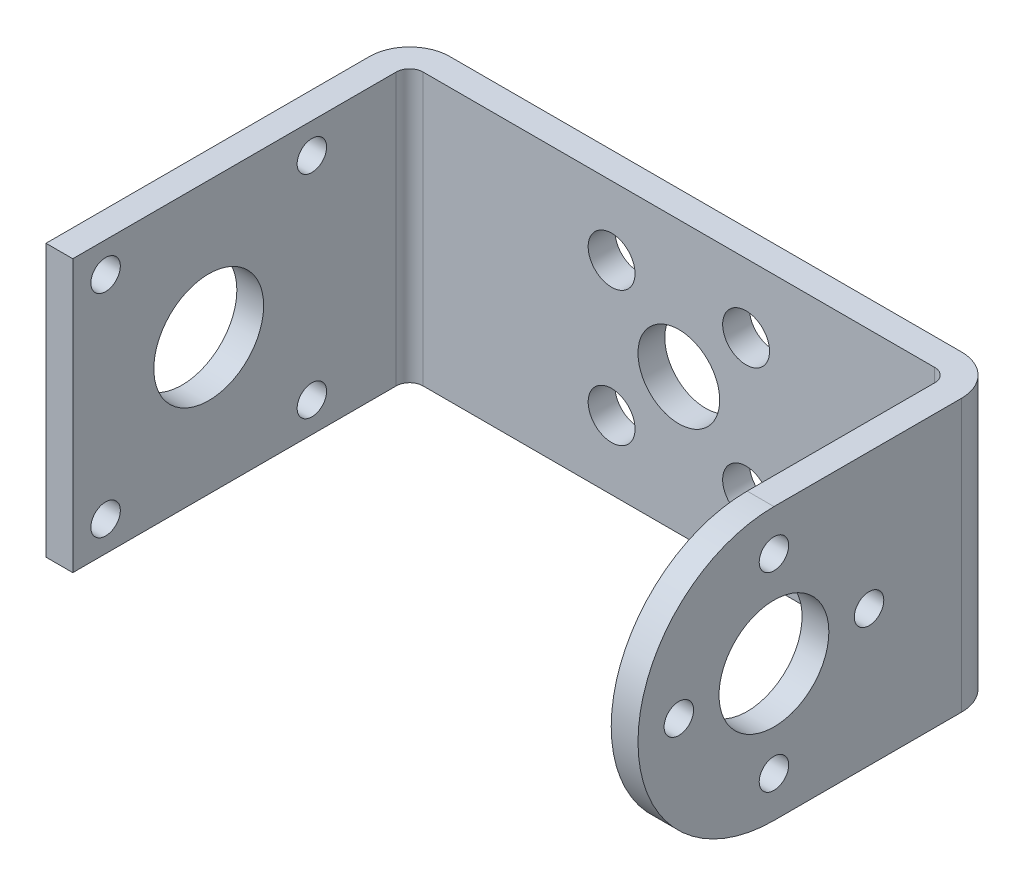
ISO-10303-21;
HEADER;
FILE_DESCRIPTION(('STEP AP214'),'2;1');
FILE_NAME('part.step','',(''),(''),'','','');
FILE_SCHEMA(('AUTOMOTIVE_DESIGN { 1 0 10303 214 1 1 1 1 }'));
ENDSEC;
DATA;
#1=APPLICATION_CONTEXT('core data for automotive mechanical design processes');
#2=APPLICATION_PROTOCOL_DEFINITION('international standard','automotive_design',2000,#1);
#3=PRODUCT_CONTEXT('',#1,'mechanical');
#4=PRODUCT('Part','Part','',(#3));
#5=PRODUCT_RELATED_PRODUCT_CATEGORY('part','',(#4));
#6=PRODUCT_DEFINITION_FORMATION('','',#4);
#7=PRODUCT_DEFINITION_CONTEXT('part definition',#1,'design');
#8=PRODUCT_DEFINITION('design','',#6,#7);
#9=PRODUCT_DEFINITION_SHAPE('','',#8);
#10=(LENGTH_UNIT() NAMED_UNIT(*) SI_UNIT(.MILLI.,.METRE.));
#11=(NAMED_UNIT(*) PLANE_ANGLE_UNIT() SI_UNIT($,.RADIAN.));
#12=(NAMED_UNIT(*) SI_UNIT($,.STERADIAN.) SOLID_ANGLE_UNIT());
#13=UNCERTAINTY_MEASURE_WITH_UNIT(LENGTH_MEASURE(1.E-05),#10,'distance_accuracy_value','');
#14=(GEOMETRIC_REPRESENTATION_CONTEXT(3) GLOBAL_UNCERTAINTY_ASSIGNED_CONTEXT((#13)) GLOBAL_UNIT_ASSIGNED_CONTEXT((#10,
#11,#12)) REPRESENTATION_CONTEXT('',''));
#15=CARTESIAN_POINT('',(0.,0.,0.));
#16=DIRECTION('',(0.,0.,1.));
#17=DIRECTION('',(1.,0.,0.));
#18=AXIS2_PLACEMENT_3D('',#15,#16,#17);
#19=CARTESIAN_POINT('',(0.,0.,-18.5528756476684));
#20=DIRECTION('',(0.,1.,0.));
#21=DIRECTION('',(1.,0.,0.));
#22=AXIS2_PLACEMENT_3D('',#19,#20,#21);
#23=PLANE('',#22);
#24=CARTESIAN_POINT('',(19.1,0.,-24.15));
#25=DIRECTION('',(0.,1.,0.));
#26=DIRECTION('',(0.707106781186547,0.,-0.707106781186548));
#27=AXIS2_PLACEMENT_3D('',#24,#25,#26);
#28=CIRCLE('',#27,3.);
#29=CARTESIAN_POINT('',(22.1,0.,-24.15));
#30=VERTEX_POINT('',#29);
#31=CARTESIAN_POINT('',(19.1,0.,-27.15));
#32=VERTEX_POINT('',#31);
#33=EDGE_CURVE('E371',#30,#32,#28,.T.);
#34=ORIENTED_EDGE('',*,*,#33,.F.);
#35=DIRECTION('',(0.,0.,-1.));
#36=VECTOR('',#35,1.);
#37=CARTESIAN_POINT('',(22.1,0.,0.));
#38=LINE('',#37,#36);
#39=CARTESIAN_POINT('',(22.1,0.,-10.15));
#40=VERTEX_POINT('',#39);
#41=EDGE_CURVE('E517',#40,#30,#38,.T.);
#42=ORIENTED_EDGE('',*,*,#41,.F.);
#43=DIRECTION('',(1.,0.,0.));
#44=VECTOR('',#43,1.);
#45=CARTESIAN_POINT('',(10.05,0.,-10.15));
#46=LINE('',#45,#44);
#47=CARTESIAN_POINT('',(20.1,0.,-10.15));
#48=VERTEX_POINT('',#47);
#49=EDGE_CURVE('E383',#48,#40,#46,.T.);
#50=ORIENTED_EDGE('',*,*,#49,.F.);
#51=DIRECTION('',(0.,0.,1.));
#52=VECTOR('',#51,1.);
#53=CARTESIAN_POINT('',(20.1,0.,-25.15));
#54=LINE('',#53,#52);
#55=CARTESIAN_POINT('',(20.1,0.,-24.15));
#56=VERTEX_POINT('',#55);
#57=EDGE_CURVE('E327',#56,#48,#54,.T.);
#58=ORIENTED_EDGE('',*,*,#57,.F.);
#59=CARTESIAN_POINT('',(19.1,0.,-24.15));
#60=DIRECTION('',(0.,-1.,0.));
#61=DIRECTION('',(0.707106781186546,0.,-0.707106781186549));
#62=AXIS2_PLACEMENT_3D('',#59,#60,#61);
#63=CIRCLE('',#62,1.);
#64=CARTESIAN_POINT('',(19.1,0.,-25.15));
#65=VERTEX_POINT('',#64);
#66=EDGE_CURVE('E332',#65,#56,#63,.T.);
#67=ORIENTED_EDGE('',*,*,#66,.F.);
#68=DIRECTION('',(1.,0.,0.));
#69=VECTOR('',#68,1.);
#70=CARTESIAN_POINT('',(-20.1,0.,-25.15));
#71=LINE('',#70,#69);
#72=CARTESIAN_POINT('',(-19.1,0.,-25.15));
#73=VERTEX_POINT('',#72);
#74=EDGE_CURVE('E379',#73,#65,#71,.T.);
#75=ORIENTED_EDGE('',*,*,#74,.F.);
#76=CARTESIAN_POINT('',(-19.1,0.,-24.15));
#77=DIRECTION('',(0.,-1.,0.));
#78=DIRECTION('',(-0.707106781186546,0.,-0.707106781186549));
#79=AXIS2_PLACEMENT_3D('',#76,#77,#78);
#80=CIRCLE('',#79,1.);
#81=CARTESIAN_POINT('',(-20.1,0.,-24.15));
#82=VERTEX_POINT('',#81);
#83=EDGE_CURVE('E337',#82,#73,#80,.T.);
#84=ORIENTED_EDGE('',*,*,#83,.F.);
#85=DIRECTION('',(0.,0.,-1.));
#86=VECTOR('',#85,1.);
#87=CARTESIAN_POINT('',(-20.1,0.,0.));
#88=LINE('',#87,#86);
#89=CARTESIAN_POINT('',(-20.1,0.,0.));
#90=VERTEX_POINT('',#89);
#91=EDGE_CURVE('E27',#90,#82,#88,.T.);
#92=ORIENTED_EDGE('',*,*,#91,.F.);
#93=DIRECTION('',(1.,0.,0.));
#94=VECTOR('',#93,1.);
#95=CARTESIAN_POINT('',(-22.1,0.,0.));
#96=LINE('',#95,#94);
#97=CARTESIAN_POINT('',(-22.1,0.,0.));
#98=VERTEX_POINT('',#97);
#99=EDGE_CURVE('E11',#98,#90,#96,.T.);
#100=ORIENTED_EDGE('',*,*,#99,.F.);
#101=DIRECTION('',(0.,0.,1.));
#102=VECTOR('',#101,1.);
#103=CARTESIAN_POINT('',(-22.1,0.,-27.15));
#104=LINE('',#103,#102);
#105=CARTESIAN_POINT('',(-22.1,0.,-24.15));
#106=VERTEX_POINT('',#105);
#107=EDGE_CURVE('E348',#106,#98,#104,.T.);
#108=ORIENTED_EDGE('',*,*,#107,.F.);
#109=CARTESIAN_POINT('',(-19.1,0.,-24.15));
#110=DIRECTION('',(0.,1.,0.));
#111=DIRECTION('',(-0.707106781186548,0.,-0.707106781186548));
#112=AXIS2_PLACEMENT_3D('',#109,#110,#111);
#113=CIRCLE('',#112,3.);
#114=CARTESIAN_POINT('',(-19.1,0.,-27.15));
#115=VERTEX_POINT('',#114);
#116=EDGE_CURVE('E272',#115,#106,#113,.T.);
#117=ORIENTED_EDGE('',*,*,#116,.F.);
#118=DIRECTION('',(-1.,0.,0.));
#119=VECTOR('',#118,1.);
#120=CARTESIAN_POINT('',(22.1,0.,-27.15));
#121=LINE('',#120,#119);
#122=EDGE_CURVE('E367',#32,#115,#121,.T.);
#123=ORIENTED_EDGE('',*,*,#122,.F.);
#124=EDGE_LOOP('',(#34,#42,#50,#58,#67,#75,#84,#92,#100,#108,#117,#123));
#125=FACE_BOUND('',#124,.T.);
#126=ADVANCED_FACE('F16',(#125),#23,.F.);
#127=CARTESIAN_POINT('',(-22.1,0.,0.));
#128=DIRECTION('',(0.,0.,1.));
#129=DIRECTION('',(1.,0.,0.));
#130=AXIS2_PLACEMENT_3D('',#127,#128,#129);
#131=PLANE('',#130);
#132=ORIENTED_EDGE('',*,*,#99,.T.);
#133=DIRECTION('',(0.,1.,0.));
#134=VECTOR('',#133,1.);
#135=CARTESIAN_POINT('',(-20.1,0.,0.));
#136=LINE('',#135,#134);
#137=CARTESIAN_POINT('',(-20.1,20.3,0.));
#138=VERTEX_POINT('',#137);
#139=EDGE_CURVE('E347',#90,#138,#136,.T.);
#140=ORIENTED_EDGE('',*,*,#139,.T.);
#141=DIRECTION('',(1.,0.,0.));
#142=VECTOR('',#141,1.);
#143=CARTESIAN_POINT('',(-22.1,20.3,0.));
#144=LINE('',#143,#142);
#145=CARTESIAN_POINT('',(-22.1,20.3,0.));
#146=VERTEX_POINT('',#145);
#147=EDGE_CURVE('E410',#146,#138,#144,.T.);
#148=ORIENTED_EDGE('',*,*,#147,.F.);
#149=DIRECTION('',(0.,1.,0.));
#150=VECTOR('',#149,1.);
#151=CARTESIAN_POINT('',(-22.1,0.,0.));
#152=LINE('',#151,#150);
#153=EDGE_CURVE('E344',#98,#146,#152,.T.);
#154=ORIENTED_EDGE('',*,*,#153,.F.);
#155=EDGE_LOOP('',(#132,#140,#148,#154));
#156=FACE_BOUND('',#155,.T.);
#157=ADVANCED_FACE('F673',(#156),#131,.T.);
#158=CARTESIAN_POINT('',(-20.1,0.,0.));
#159=DIRECTION('',(1.,0.,0.));
#160=DIRECTION('',(0.,0.,1.));
#161=AXIS2_PLACEMENT_3D('',#158,#159,#160);
#162=PLANE('',#161);
#163=CARTESIAN_POINT('',(-20.1,10.15,-10.15));
#164=DIRECTION('',(-1.,0.,0.));
#165=DIRECTION('',(0.,0.,1.));
#166=AXIS2_PLACEMENT_3D('',#163,#164,#165);
#167=CIRCLE('',#166,4.1);
#168=CARTESIAN_POINT('',(-20.1,10.15,-14.25));
#169=VERTEX_POINT('',#168);
#170=EDGE_CURVE('E352',#169,#169,#167,.T.);
#171=ORIENTED_EDGE('',*,*,#170,.T.);
#172=EDGE_LOOP('',(#171));
#173=FACE_BOUND('',#172,.T.);
#174=CARTESIAN_POINT('',(-20.1,18.05,-2.45));
#175=DIRECTION('',(-1.,0.,0.));
#176=DIRECTION('',(0.,0.,1.));
#177=AXIS2_PLACEMENT_3D('',#174,#175,#176);
#178=CIRCLE('',#177,1.1);
#179=CARTESIAN_POINT('',(-20.1,18.05,-3.55));
#180=VERTEX_POINT('',#179);
#181=EDGE_CURVE('E499',#180,#180,#178,.T.);
#182=ORIENTED_EDGE('',*,*,#181,.T.);
#183=EDGE_LOOP('',(#182));
#184=FACE_BOUND('',#183,.T.);
#185=CARTESIAN_POINT('',(-20.1,2.25,-17.85));
#186=DIRECTION('',(-1.,0.,0.));
#187=DIRECTION('',(0.,0.,1.));
#188=AXIS2_PLACEMENT_3D('',#185,#186,#187);
#189=CIRCLE('',#188,1.1);
#190=CARTESIAN_POINT('',(-20.1,2.25,-18.95));
#191=VERTEX_POINT('',#190);
#192=EDGE_CURVE('E313',#191,#191,#189,.T.);
#193=ORIENTED_EDGE('',*,*,#192,.T.);
#194=EDGE_LOOP('',(#193));
#195=FACE_BOUND('',#194,.T.);
#196=CARTESIAN_POINT('',(-20.1,2.25,-2.45));
#197=DIRECTION('',(-1.,0.,0.));
#198=DIRECTION('',(0.,0.,1.));
#199=AXIS2_PLACEMENT_3D('',#196,#197,#198);
#200=CIRCLE('',#199,1.1);
#201=CARTESIAN_POINT('',(-20.1,2.25,-3.55));
#202=VERTEX_POINT('',#201);
#203=EDGE_CURVE('E389',#202,#202,#200,.T.);
#204=ORIENTED_EDGE('',*,*,#203,.T.);
#205=EDGE_LOOP('',(#204));
#206=FACE_BOUND('',#205,.T.);
#207=CARTESIAN_POINT('',(-20.1,18.05,-17.85));
#208=DIRECTION('',(-1.,0.,0.));
#209=DIRECTION('',(0.,0.,1.));
#210=AXIS2_PLACEMENT_3D('',#207,#208,#209);
#211=CIRCLE('',#210,1.1);
#212=CARTESIAN_POINT('',(-20.1,18.05,-18.95));
#213=VERTEX_POINT('',#212);
#214=EDGE_CURVE('E358',#213,#213,#211,.T.);
#215=ORIENTED_EDGE('',*,*,#214,.T.);
#216=EDGE_LOOP('',(#215));
#217=FACE_BOUND('',#216,.T.);
#218=DIRECTION('',(0.,-1.,0.));
#219=VECTOR('',#218,1.);
#220=CARTESIAN_POINT('',(-20.1,0.,-24.15));
#221=LINE('',#220,#219);
#222=CARTESIAN_POINT('',(-20.1,20.3,-24.15));
#223=VERTEX_POINT('',#222);
#224=EDGE_CURVE('E336',#223,#82,#221,.T.);
#225=ORIENTED_EDGE('',*,*,#224,.F.);
#226=DIRECTION('',(0.,0.,-1.));
#227=VECTOR('',#226,1.);
#228=CARTESIAN_POINT('',(-20.1,20.3,0.));
#229=LINE('',#228,#227);
#230=EDGE_CURVE('E425',#138,#223,#229,.T.);
#231=ORIENTED_EDGE('',*,*,#230,.F.);
#232=ORIENTED_EDGE('',*,*,#139,.F.);
#233=ORIENTED_EDGE('',*,*,#91,.T.);
#234=EDGE_LOOP('',(#225,#231,#232,#233));
#235=FACE_BOUND('',#234,.T.);
#236=ADVANCED_FACE('F18',(#173,#184,#195,#206,#217,#235),#162,.T.);
#237=CARTESIAN_POINT('',(-22.1,0.,-27.15));
#238=DIRECTION('',(-1.,0.,0.));
#239=DIRECTION('',(0.,1.,0.));
#240=AXIS2_PLACEMENT_3D('',#237,#238,#239);
#241=PLANE('',#240);
#242=CARTESIAN_POINT('',(-22.1,10.15,-10.15));
#243=DIRECTION('',(1.,0.,0.));
#244=DIRECTION('',(0.,0.,1.));
#245=AXIS2_PLACEMENT_3D('',#242,#243,#244);
#246=CIRCLE('',#245,4.1);
#247=CARTESIAN_POINT('',(-22.1,10.15,-14.25));
#248=VERTEX_POINT('',#247);
#249=EDGE_CURVE('E460',#248,#248,#246,.T.);
#250=ORIENTED_EDGE('',*,*,#249,.T.);
#251=EDGE_LOOP('',(#250));
#252=FACE_BOUND('',#251,.T.);
#253=CARTESIAN_POINT('',(-22.1,18.05,-2.45));
#254=DIRECTION('',(1.,0.,0.));
#255=DIRECTION('',(0.,0.,1.));
#256=AXIS2_PLACEMENT_3D('',#253,#254,#255);
#257=CIRCLE('',#256,1.1);
#258=CARTESIAN_POINT('',(-22.1,18.05,-1.34999999999998));
#259=VERTEX_POINT('',#258);
#260=CARTESIAN_POINT('',(-22.1,18.05,-3.55));
#261=VERTEX_POINT('',#260);
#262=EDGE_CURVE('E304',#259,#261,#257,.T.);
#263=ORIENTED_EDGE('',*,*,#262,.T.);
#264=CARTESIAN_POINT('',(-22.1,18.05,-2.45));
#265=DIRECTION('',(1.,0.,0.));
#266=DIRECTION('',(0.,0.,1.));
#267=AXIS2_PLACEMENT_3D('',#264,#265,#266);
#268=CIRCLE('',#267,1.1);
#269=EDGE_CURVE('E300',#261,#259,#268,.T.);
#270=ORIENTED_EDGE('',*,*,#269,.T.);
#271=EDGE_LOOP('',(#263,#270));
#272=FACE_BOUND('',#271,.T.);
#273=CARTESIAN_POINT('',(-22.1,2.25,-17.85));
#274=DIRECTION('',(1.,0.,0.));
#275=DIRECTION('',(0.,0.,1.));
#276=AXIS2_PLACEMENT_3D('',#273,#274,#275);
#277=CIRCLE('',#276,1.1);
#278=CARTESIAN_POINT('',(-22.1,2.25,-16.75));
#279=VERTEX_POINT('',#278);
#280=CARTESIAN_POINT('',(-22.1,2.25,-18.95));
#281=VERTEX_POINT('',#280);
#282=EDGE_CURVE('E443',#279,#281,#277,.T.);
#283=ORIENTED_EDGE('',*,*,#282,.T.);
#284=CARTESIAN_POINT('',(-22.1,2.25,-17.85));
#285=DIRECTION('',(1.,0.,0.));
#286=DIRECTION('',(0.,0.,1.));
#287=AXIS2_PLACEMENT_3D('',#284,#285,#286);
#288=CIRCLE('',#287,1.1);
#289=EDGE_CURVE('E464',#281,#279,#288,.T.);
#290=ORIENTED_EDGE('',*,*,#289,.T.);
#291=EDGE_LOOP('',(#283,#290));
#292=FACE_BOUND('',#291,.T.);
#293=CARTESIAN_POINT('',(-22.1,2.25,-2.45));
#294=DIRECTION('',(1.,0.,0.));
#295=DIRECTION('',(0.,0.,1.));
#296=AXIS2_PLACEMENT_3D('',#293,#294,#295);
#297=CIRCLE('',#296,1.1);
#298=CARTESIAN_POINT('',(-22.1,2.25,-1.34999999999998));
#299=VERTEX_POINT('',#298);
#300=CARTESIAN_POINT('',(-22.1,2.25,-3.55));
#301=VERTEX_POINT('',#300);
#302=EDGE_CURVE('E361',#299,#301,#297,.T.);
#303=ORIENTED_EDGE('',*,*,#302,.T.);
#304=CARTESIAN_POINT('',(-22.1,2.25,-2.45));
#305=DIRECTION('',(1.,0.,0.));
#306=DIRECTION('',(0.,0.,1.));
#307=AXIS2_PLACEMENT_3D('',#304,#305,#306);
#308=CIRCLE('',#307,1.1);
#309=EDGE_CURVE('E390',#301,#299,#308,.T.);
#310=ORIENTED_EDGE('',*,*,#309,.T.);
#311=EDGE_LOOP('',(#303,#310));
#312=FACE_BOUND('',#311,.T.);
#313=CARTESIAN_POINT('',(-22.1,18.05,-17.85));
#314=DIRECTION('',(1.,0.,0.));
#315=DIRECTION('',(0.,0.,1.));
#316=AXIS2_PLACEMENT_3D('',#313,#314,#315);
#317=CIRCLE('',#316,1.1);
#318=CARTESIAN_POINT('',(-22.1,18.05,-16.75));
#319=VERTEX_POINT('',#318);
#320=CARTESIAN_POINT('',(-22.1,18.05,-18.95));
#321=VERTEX_POINT('',#320);
#322=EDGE_CURVE('E486',#319,#321,#317,.T.);
#323=ORIENTED_EDGE('',*,*,#322,.T.);
#324=CARTESIAN_POINT('',(-22.1,18.05,-17.85));
#325=DIRECTION('',(1.,0.,0.));
#326=DIRECTION('',(0.,0.,1.));
#327=AXIS2_PLACEMENT_3D('',#324,#325,#326);
#328=CIRCLE('',#327,1.1);
#329=EDGE_CURVE('E483',#321,#319,#328,.T.);
#330=ORIENTED_EDGE('',*,*,#329,.T.);
#331=EDGE_LOOP('',(#323,#330));
#332=FACE_BOUND('',#331,.T.);
#333=DIRECTION('',(0.,1.,0.));
#334=VECTOR('',#333,1.);
#335=CARTESIAN_POINT('',(-22.1,0.,-24.15));
#336=LINE('',#335,#334);
#337=CARTESIAN_POINT('',(-22.1,20.3,-24.15));
#338=VERTEX_POINT('',#337);
#339=EDGE_CURVE('E323',#106,#338,#336,.T.);
#340=ORIENTED_EDGE('',*,*,#339,.F.);
#341=ORIENTED_EDGE('',*,*,#107,.T.);
#342=ORIENTED_EDGE('',*,*,#153,.T.);
#343=DIRECTION('',(0.,0.,1.));
#344=VECTOR('',#343,1.);
#345=CARTESIAN_POINT('',(-22.1,20.3,-27.15));
#346=LINE('',#345,#344);
#347=EDGE_CURVE('E406',#338,#146,#346,.T.);
#348=ORIENTED_EDGE('',*,*,#347,.F.);
#349=EDGE_LOOP('',(#340,#341,#342,#348));
#350=FACE_BOUND('',#349,.T.);
#351=ADVANCED_FACE('F302',(#252,#272,#292,#312,#332,#350),#241,.T.);
#352=CARTESIAN_POINT('',(22.1,0.,0.));
#353=DIRECTION('',(1.,0.,0.));
#354=DIRECTION('',(0.,0.,-1.));
#355=AXIS2_PLACEMENT_3D('',#352,#353,#354);
#356=PLANE('',#355);
#357=CARTESIAN_POINT('',(22.1,10.15,-10.15));
#358=DIRECTION('',(-1.,0.,0.));
#359=DIRECTION('',(0.,0.,1.));
#360=AXIS2_PLACEMENT_3D('',#357,#358,#359);
#361=CIRCLE('',#360,4.1);
#362=CARTESIAN_POINT('',(22.1,10.15,-14.25));
#363=VERTEX_POINT('',#362);
#364=EDGE_CURVE('E463',#363,#363,#361,.T.);
#365=ORIENTED_EDGE('',*,*,#364,.T.);
#366=EDGE_LOOP('',(#365));
#367=FACE_BOUND('',#366,.T.);
#368=CARTESIAN_POINT('',(22.1,10.15,-3.05));
#369=DIRECTION('',(-1.,0.,0.));
#370=DIRECTION('',(0.,0.,-1.));
#371=AXIS2_PLACEMENT_3D('',#368,#369,#370);
#372=CIRCLE('',#371,1.1);
#373=CARTESIAN_POINT('',(22.1,10.15,-4.15));
#374=VERTEX_POINT('',#373);
#375=CARTESIAN_POINT('',(22.1,10.15,-1.95));
#376=VERTEX_POINT('',#375);
#377=EDGE_CURVE('E476',#374,#376,#372,.T.);
#378=ORIENTED_EDGE('',*,*,#377,.T.);
#379=CARTESIAN_POINT('',(22.1,10.15,-3.05));
#380=DIRECTION('',(-1.,0.,0.));
#381=DIRECTION('',(0.,0.,-1.));
#382=AXIS2_PLACEMENT_3D('',#379,#380,#381);
#383=CIRCLE('',#382,1.1);
#384=EDGE_CURVE('E414',#376,#374,#383,.T.);
#385=ORIENTED_EDGE('',*,*,#384,.T.);
#386=EDGE_LOOP('',(#378,#385));
#387=FACE_BOUND('',#386,.T.);
#388=CARTESIAN_POINT('',(22.1,10.15,-17.25));
#389=DIRECTION('',(-1.,0.,0.));
#390=DIRECTION('',(0.,0.,-1.));
#391=AXIS2_PLACEMENT_3D('',#388,#389,#390);
#392=CIRCLE('',#391,1.1);
#393=CARTESIAN_POINT('',(22.1,10.15,-18.35));
#394=VERTEX_POINT('',#393);
#395=CARTESIAN_POINT('',(22.1,10.15,-16.15));
#396=VERTEX_POINT('',#395);
#397=EDGE_CURVE('E528',#394,#396,#392,.T.);
#398=ORIENTED_EDGE('',*,*,#397,.T.);
#399=CARTESIAN_POINT('',(22.1,10.15,-17.25));
#400=DIRECTION('',(-1.,0.,0.));
#401=DIRECTION('',(0.,0.,-1.));
#402=AXIS2_PLACEMENT_3D('',#399,#400,#401);
#403=CIRCLE('',#402,1.1);
#404=EDGE_CURVE('E540',#396,#394,#403,.T.);
#405=ORIENTED_EDGE('',*,*,#404,.T.);
#406=EDGE_LOOP('',(#398,#405));
#407=FACE_BOUND('',#406,.T.);
#408=CARTESIAN_POINT('',(22.1,17.25,-10.15));
#409=DIRECTION('',(-1.,0.,0.));
#410=DIRECTION('',(0.,0.,-1.));
#411=AXIS2_PLACEMENT_3D('',#408,#409,#410);
#412=CIRCLE('',#411,1.1);
#413=CARTESIAN_POINT('',(22.1,17.25,-11.25));
#414=VERTEX_POINT('',#413);
#415=CARTESIAN_POINT('',(22.1,17.25,-9.05));
#416=VERTEX_POINT('',#415);
#417=EDGE_CURVE('E454',#414,#416,#412,.T.);
#418=ORIENTED_EDGE('',*,*,#417,.T.);
#419=CARTESIAN_POINT('',(22.1,17.25,-10.15));
#420=DIRECTION('',(-1.,0.,0.));
#421=DIRECTION('',(0.,0.,-1.));
#422=AXIS2_PLACEMENT_3D('',#419,#420,#421);
#423=CIRCLE('',#422,1.1);
#424=EDGE_CURVE('E458',#416,#414,#423,.T.);
#425=ORIENTED_EDGE('',*,*,#424,.T.);
#426=EDGE_LOOP('',(#418,#425));
#427=FACE_BOUND('',#426,.T.);
#428=CARTESIAN_POINT('',(22.1,3.05,-10.15));
#429=DIRECTION('',(-1.,0.,0.));
#430=DIRECTION('',(0.,0.,-1.));
#431=AXIS2_PLACEMENT_3D('',#428,#429,#430);
#432=CIRCLE('',#431,1.1);
#433=CARTESIAN_POINT('',(22.1,3.05,-11.25));
#434=VERTEX_POINT('',#433);
#435=CARTESIAN_POINT('',(22.1,3.05,-9.05));
#436=VERTEX_POINT('',#435);
#437=EDGE_CURVE('E502',#434,#436,#432,.T.);
#438=ORIENTED_EDGE('',*,*,#437,.T.);
#439=CARTESIAN_POINT('',(22.1,3.05,-10.15));
#440=DIRECTION('',(-1.,0.,0.));
#441=DIRECTION('',(0.,0.,-1.));
#442=AXIS2_PLACEMENT_3D('',#439,#440,#441);
#443=CIRCLE('',#442,1.1);
#444=EDGE_CURVE('E509',#436,#434,#443,.T.);
#445=ORIENTED_EDGE('',*,*,#444,.T.);
#446=EDGE_LOOP('',(#438,#445));
#447=FACE_BOUND('',#446,.T.);
#448=DIRECTION('',(0.,-1.,0.));
#449=VECTOR('',#448,1.);
#450=CARTESIAN_POINT('',(22.1,0.,-24.15));
#451=LINE('',#450,#449);
#452=CARTESIAN_POINT('',(22.1,20.3,-24.15));
#453=VERTEX_POINT('',#452);
#454=EDGE_CURVE('E368',#453,#30,#451,.T.);
#455=ORIENTED_EDGE('',*,*,#454,.F.);
#456=DIRECTION('',(0.,0.,-1.));
#457=VECTOR('',#456,1.);
#458=CARTESIAN_POINT('',(22.1,20.3,0.));
#459=LINE('',#458,#457);
#460=CARTESIAN_POINT('',(22.1,20.3,-10.15));
#461=VERTEX_POINT('',#460);
#462=EDGE_CURVE('E363',#461,#453,#459,.T.);
#463=ORIENTED_EDGE('',*,*,#462,.F.);
#464=CARTESIAN_POINT('',(22.1,10.15,-10.15));
#465=DIRECTION('',(-1.,0.,0.));
#466=DIRECTION('',(0.,0.707106781186548,0.707106781186548));
#467=AXIS2_PLACEMENT_3D('',#464,#465,#466);
#468=CIRCLE('',#467,10.15);
#469=EDGE_CURVE('E380',#40,#461,#468,.T.);
#470=ORIENTED_EDGE('',*,*,#469,.F.);
#471=ORIENTED_EDGE('',*,*,#41,.T.);
#472=EDGE_LOOP('',(#455,#463,#470,#471));
#473=FACE_BOUND('',#472,.T.);
#474=ADVANCED_FACE('F603',(#367,#387,#407,#427,#447,#473),#356,.T.);
#475=CARTESIAN_POINT('',(10.05,10.15,-10.15));
#476=DIRECTION('',(1.,0.,0.));
#477=DIRECTION('',(0.,0.707106781186548,0.707106781186548));
#478=AXIS2_PLACEMENT_3D('',#475,#476,#477);
#479=CYLINDRICAL_SURFACE('',#478,10.15);
#480=ORIENTED_EDGE('',*,*,#469,.T.);
#481=DIRECTION('',(-1.,0.,0.));
#482=VECTOR('',#481,1.);
#483=CARTESIAN_POINT('',(10.05,20.3,-10.15));
#484=LINE('',#483,#482);
#485=CARTESIAN_POINT('',(20.1,20.3,-10.15));
#486=VERTEX_POINT('',#485);
#487=EDGE_CURVE('E342',#461,#486,#484,.T.);
#488=ORIENTED_EDGE('',*,*,#487,.T.);
#489=CARTESIAN_POINT('',(20.1,10.15,-10.15));
#490=DIRECTION('',(1.,0.,0.));
#491=DIRECTION('',(0.,-0.707106781186548,0.707106781186548));
#492=AXIS2_PLACEMENT_3D('',#489,#490,#491);
#493=CIRCLE('',#492,10.15);
#494=EDGE_CURVE('E415',#486,#48,#493,.T.);
#495=ORIENTED_EDGE('',*,*,#494,.T.);
#496=ORIENTED_EDGE('',*,*,#49,.T.);
#497=EDGE_LOOP('',(#480,#488,#495,#496));
#498=FACE_BOUND('',#497,.T.);
#499=ADVANCED_FACE('F799',(#498),#479,.T.);
#500=CARTESIAN_POINT('',(22.1,10.15,-10.15));
#501=DIRECTION('',(-1.,0.,0.));
#502=DIRECTION('',(0.,0.,1.));
#503=AXIS2_PLACEMENT_3D('',#500,#501,#502);
#504=CYLINDRICAL_SURFACE('',#503,4.1);
#505=ORIENTED_EDGE('',*,*,#364,.F.);
#506=DIRECTION('',(-1.,0.,0.));
#507=VECTOR('',#506,1.);
#508=CARTESIAN_POINT('',(22.1,10.15,-14.25));
#509=LINE('',#508,#507);
#510=CARTESIAN_POINT('',(20.1,10.15,-14.25));
#511=VERTEX_POINT('',#510);
#512=EDGE_CURVE('E384',#363,#511,#509,.T.);
#513=ORIENTED_EDGE('',*,*,#512,.T.);
#514=CARTESIAN_POINT('',(20.1,10.15,-10.15));
#515=DIRECTION('',(1.,0.,0.));
#516=DIRECTION('',(0.,0.,1.));
#517=AXIS2_PLACEMENT_3D('',#514,#515,#516);
#518=CIRCLE('',#517,4.1);
#519=EDGE_CURVE('E419',#511,#511,#518,.T.);
#520=ORIENTED_EDGE('',*,*,#519,.F.);
#521=ORIENTED_EDGE('',*,*,#512,.F.);
#522=EDGE_LOOP('',(#505,#513,#520,#521));
#523=FACE_BOUND('',#522,.T.);
#524=ADVANCED_FACE('F794',(#523),#504,.F.);
#525=CARTESIAN_POINT('',(22.1,10.15,-10.15));
#526=DIRECTION('',(-1.,0.,0.));
#527=DIRECTION('',(0.,0.,1.));
#528=AXIS2_PLACEMENT_3D('',#525,#526,#527);
#529=CYLINDRICAL_SURFACE('',#528,4.1);
#530=ORIENTED_EDGE('',*,*,#170,.F.);
#531=DIRECTION('',(-1.,0.,0.));
#532=VECTOR('',#531,1.);
#533=CARTESIAN_POINT('',(22.1,10.15,-14.25));
#534=LINE('',#533,#532);
#535=EDGE_CURVE('E356',#169,#248,#534,.T.);
#536=ORIENTED_EDGE('',*,*,#535,.T.);
#537=ORIENTED_EDGE('',*,*,#249,.F.);
#538=ORIENTED_EDGE('',*,*,#535,.F.);
#539=EDGE_LOOP('',(#530,#536,#537,#538));
#540=FACE_BOUND('',#539,.T.);
#541=ADVANCED_FACE('F669',(#540),#529,.F.);
#542=CARTESIAN_POINT('',(-33.6032539444511,10.15,-3.05));
#543=DIRECTION('',(1.,0.,0.));
#544=DIRECTION('',(0.,0.,-1.));
#545=AXIS2_PLACEMENT_3D('',#542,#543,#544);
#546=CYLINDRICAL_SURFACE('',#545,1.1);
#547=ORIENTED_EDGE('',*,*,#377,.F.);
#548=ORIENTED_EDGE('',*,*,#384,.F.);
#549=DIRECTION('',(-1.,0.,0.));
#550=VECTOR('',#549,1.);
#551=CARTESIAN_POINT('',(-33.6032539444511,10.15,-1.95));
#552=LINE('',#551,#550);
#553=CARTESIAN_POINT('',(20.1,10.15,-1.95));
#554=VERTEX_POINT('',#553);
#555=EDGE_CURVE('E357',#376,#554,#552,.T.);
#556=ORIENTED_EDGE('',*,*,#555,.T.);
#557=CARTESIAN_POINT('',(20.1,10.15,-3.05));
#558=DIRECTION('',(1.,0.,0.));
#559=DIRECTION('',(0.,0.,-1.));
#560=AXIS2_PLACEMENT_3D('',#557,#558,#559);
#561=CIRCLE('',#560,1.1);
#562=EDGE_CURVE('E547',#554,#554,#561,.T.);
#563=ORIENTED_EDGE('',*,*,#562,.F.);
#564=ORIENTED_EDGE('',*,*,#555,.F.);
#565=EDGE_LOOP('',(#547,#548,#556,#563,#564));
#566=FACE_BOUND('',#565,.T.);
#567=ADVANCED_FACE('F827',(#566),#546,.F.);
#568=CARTESIAN_POINT('',(-33.6032539444511,10.15,-17.25));
#569=DIRECTION('',(1.,0.,0.));
#570=DIRECTION('',(0.,0.,-1.));
#571=AXIS2_PLACEMENT_3D('',#568,#569,#570);
#572=CYLINDRICAL_SURFACE('',#571,1.1);
#573=ORIENTED_EDGE('',*,*,#397,.F.);
#574=ORIENTED_EDGE('',*,*,#404,.F.);
#575=DIRECTION('',(-1.,0.,0.));
#576=VECTOR('',#575,1.);
#577=CARTESIAN_POINT('',(-33.6032539444511,10.15,-16.15));
#578=LINE('',#577,#576);
#579=CARTESIAN_POINT('',(20.1,10.15,-16.15));
#580=VERTEX_POINT('',#579);
#581=EDGE_CURVE('E513',#396,#580,#578,.T.);
#582=ORIENTED_EDGE('',*,*,#581,.T.);
#583=CARTESIAN_POINT('',(20.1,10.15,-17.25));
#584=DIRECTION('',(1.,0.,0.));
#585=DIRECTION('',(0.,0.,-1.));
#586=AXIS2_PLACEMENT_3D('',#583,#584,#585);
#587=CIRCLE('',#586,1.1);
#588=EDGE_CURVE('E551',#580,#580,#587,.T.);
#589=ORIENTED_EDGE('',*,*,#588,.F.);
#590=ORIENTED_EDGE('',*,*,#581,.F.);
#591=EDGE_LOOP('',(#573,#574,#582,#589,#590));
#592=FACE_BOUND('',#591,.T.);
#593=ADVANCED_FACE('F832',(#592),#572,.F.);
#594=CARTESIAN_POINT('',(-33.6032539444511,17.25,-10.15));
#595=DIRECTION('',(1.,0.,0.));
#596=DIRECTION('',(0.,0.,-1.));
#597=AXIS2_PLACEMENT_3D('',#594,#595,#596);
#598=CYLINDRICAL_SURFACE('',#597,1.1);
#599=ORIENTED_EDGE('',*,*,#417,.F.);
#600=ORIENTED_EDGE('',*,*,#424,.F.);
#601=DIRECTION('',(-1.,0.,0.));
#602=VECTOR('',#601,1.);
#603=CARTESIAN_POINT('',(-33.6032539444511,17.25,-9.05));
#604=LINE('',#603,#602);
#605=CARTESIAN_POINT('',(20.1,17.25,-9.05));
#606=VERTEX_POINT('',#605);
#607=EDGE_CURVE('E525',#416,#606,#604,.T.);
#608=ORIENTED_EDGE('',*,*,#607,.T.);
#609=CARTESIAN_POINT('',(20.1,17.25,-10.15));
#610=DIRECTION('',(1.,0.,0.));
#611=DIRECTION('',(0.,0.,-1.));
#612=AXIS2_PLACEMENT_3D('',#609,#610,#611);
#613=CIRCLE('',#612,1.1);
#614=EDGE_CURVE('E405',#606,#606,#613,.T.);
#615=ORIENTED_EDGE('',*,*,#614,.F.);
#616=ORIENTED_EDGE('',*,*,#607,.F.);
#617=EDGE_LOOP('',(#599,#600,#608,#615,#616));
#618=FACE_BOUND('',#617,.T.);
#619=ADVANCED_FACE('F757',(#618),#598,.F.);
#620=CARTESIAN_POINT('',(-33.6032539444511,3.05,-10.15));
#621=DIRECTION('',(1.,0.,0.));
#622=DIRECTION('',(0.,0.,-1.));
#623=AXIS2_PLACEMENT_3D('',#620,#621,#622);
#624=CYLINDRICAL_SURFACE('',#623,1.1);
#625=ORIENTED_EDGE('',*,*,#437,.F.);
#626=ORIENTED_EDGE('',*,*,#444,.F.);
#627=DIRECTION('',(-1.,0.,0.));
#628=VECTOR('',#627,1.);
#629=CARTESIAN_POINT('',(-33.6032539444511,3.05,-9.05));
#630=LINE('',#629,#628);
#631=CARTESIAN_POINT('',(20.1,3.05,-9.05));
#632=VERTEX_POINT('',#631);
#633=EDGE_CURVE('E459',#436,#632,#630,.T.);
#634=ORIENTED_EDGE('',*,*,#633,.T.);
#635=CARTESIAN_POINT('',(20.1,3.05,-10.15));
#636=DIRECTION('',(1.,0.,0.));
#637=DIRECTION('',(0.,0.,-1.));
#638=AXIS2_PLACEMENT_3D('',#635,#636,#637);
#639=CIRCLE('',#638,1.1);
#640=EDGE_CURVE('E401',#632,#632,#639,.T.);
#641=ORIENTED_EDGE('',*,*,#640,.F.);
#642=ORIENTED_EDGE('',*,*,#633,.F.);
#643=EDGE_LOOP('',(#625,#626,#634,#641,#642));
#644=FACE_BOUND('',#643,.T.);
#645=ADVANCED_FACE('F715',(#644),#624,.F.);
#646=CARTESIAN_POINT('',(33.6032539444511,18.05,-2.45));
#647=DIRECTION('',(-1.,0.,0.));
#648=DIRECTION('',(0.,0.,1.));
#649=AXIS2_PLACEMENT_3D('',#646,#647,#648);
#650=CYLINDRICAL_SURFACE('',#649,1.1);
#651=ORIENTED_EDGE('',*,*,#262,.F.);
#652=ORIENTED_EDGE('',*,*,#269,.F.);
#653=DIRECTION('',(1.,0.,0.));
#654=VECTOR('',#653,1.);
#655=CARTESIAN_POINT('',(33.6032539444511,18.05,-3.55));
#656=LINE('',#655,#654);
#657=EDGE_CURVE('E308',#261,#180,#656,.T.);
#658=ORIENTED_EDGE('',*,*,#657,.T.);
#659=ORIENTED_EDGE('',*,*,#181,.F.);
#660=ORIENTED_EDGE('',*,*,#657,.F.);
#661=EDGE_LOOP('',(#651,#652,#658,#659,#660));
#662=FACE_BOUND('',#661,.T.);
#663=ADVANCED_FACE('F310',(#662),#650,.F.);
#664=CARTESIAN_POINT('',(33.6032539444511,2.25,-17.85));
#665=DIRECTION('',(-1.,0.,0.));
#666=DIRECTION('',(0.,0.,1.));
#667=AXIS2_PLACEMENT_3D('',#664,#665,#666);
#668=CYLINDRICAL_SURFACE('',#667,1.1);
#669=ORIENTED_EDGE('',*,*,#282,.F.);
#670=ORIENTED_EDGE('',*,*,#289,.F.);
#671=DIRECTION('',(1.,0.,0.));
#672=VECTOR('',#671,1.);
#673=CARTESIAN_POINT('',(33.6032539444511,2.25,-18.95));
#674=LINE('',#673,#672);
#675=EDGE_CURVE('E319',#281,#191,#674,.T.);
#676=ORIENTED_EDGE('',*,*,#675,.T.);
#677=ORIENTED_EDGE('',*,*,#192,.F.);
#678=ORIENTED_EDGE('',*,*,#675,.F.);
#679=EDGE_LOOP('',(#669,#670,#676,#677,#678));
#680=FACE_BOUND('',#679,.T.);
#681=ADVANCED_FACE('F714',(#680),#668,.F.);
#682=CARTESIAN_POINT('',(33.6032539444511,2.25,-2.45));
#683=DIRECTION('',(-1.,0.,0.));
#684=DIRECTION('',(0.,0.,1.));
#685=AXIS2_PLACEMENT_3D('',#682,#683,#684);
#686=CYLINDRICAL_SURFACE('',#685,1.1);
#687=ORIENTED_EDGE('',*,*,#302,.F.);
#688=ORIENTED_EDGE('',*,*,#309,.F.);
#689=DIRECTION('',(1.,0.,0.));
#690=VECTOR('',#689,1.);
#691=CARTESIAN_POINT('',(33.6032539444511,2.25,-3.55));
#692=LINE('',#691,#690);
#693=EDGE_CURVE('E385',#301,#202,#692,.T.);
#694=ORIENTED_EDGE('',*,*,#693,.T.);
#695=ORIENTED_EDGE('',*,*,#203,.F.);
#696=ORIENTED_EDGE('',*,*,#693,.F.);
#697=EDGE_LOOP('',(#687,#688,#694,#695,#696));
#698=FACE_BOUND('',#697,.T.);
#699=ADVANCED_FACE('F738',(#698),#686,.F.);
#700=CARTESIAN_POINT('',(33.6032539444511,18.05,-17.85));
#701=DIRECTION('',(-1.,0.,0.));
#702=DIRECTION('',(0.,0.,1.));
#703=AXIS2_PLACEMENT_3D('',#700,#701,#702);
#704=CYLINDRICAL_SURFACE('',#703,1.1);
#705=ORIENTED_EDGE('',*,*,#322,.F.);
#706=ORIENTED_EDGE('',*,*,#329,.F.);
#707=DIRECTION('',(1.,0.,0.));
#708=VECTOR('',#707,1.);
#709=CARTESIAN_POINT('',(33.6032539444511,18.05,-18.95));
#710=LINE('',#709,#708);
#711=EDGE_CURVE('E362',#321,#213,#710,.T.);
#712=ORIENTED_EDGE('',*,*,#711,.T.);
#713=ORIENTED_EDGE('',*,*,#214,.F.);
#714=ORIENTED_EDGE('',*,*,#711,.F.);
#715=EDGE_LOOP('',(#705,#706,#712,#713,#714));
#716=FACE_BOUND('',#715,.T.);
#717=ADVANCED_FACE('F682',(#716),#704,.F.);
#718=CARTESIAN_POINT('',(0.,10.15,-27.15));
#719=DIRECTION('',(0.,0.,1.));
#720=DIRECTION('',(1.,0.,0.));
#721=AXIS2_PLACEMENT_3D('',#718,#719,#720);
#722=CYLINDRICAL_SURFACE('',#721,3.05);
#723=CARTESIAN_POINT('',(0.,10.15,-27.15));
#724=DIRECTION('',(0.,0.,1.));
#725=DIRECTION('',(1.,0.,0.));
#726=AXIS2_PLACEMENT_3D('',#723,#724,#725);
#727=CIRCLE('',#726,3.05);
#728=CARTESIAN_POINT('',(-3.05,10.15,-27.15));
#729=VERTEX_POINT('',#728);
#730=EDGE_CURVE('E394',#729,#729,#727,.T.);
#731=ORIENTED_EDGE('',*,*,#730,.F.);
#732=DIRECTION('',(0.,0.,1.));
#733=VECTOR('',#732,1.);
#734=CARTESIAN_POINT('',(-3.05,10.15,-27.15));
#735=LINE('',#734,#733);
#736=CARTESIAN_POINT('',(-3.05,10.15,-25.15));
#737=VERTEX_POINT('',#736);
#738=EDGE_CURVE('E546',#729,#737,#735,.T.);
#739=ORIENTED_EDGE('',*,*,#738,.T.);
#740=CARTESIAN_POINT('',(0.,10.15,-25.15));
#741=DIRECTION('',(0.,0.,-1.));
#742=DIRECTION('',(1.,0.,0.));
#743=AXIS2_PLACEMENT_3D('',#740,#741,#742);
#744=CIRCLE('',#743,3.05);
#745=EDGE_CURVE('E374',#737,#737,#744,.T.);
#746=ORIENTED_EDGE('',*,*,#745,.F.);
#747=ORIENTED_EDGE('',*,*,#738,.F.);
#748=EDGE_LOOP('',(#731,#739,#746,#747));
#749=FACE_BOUND('',#748,.T.);
#750=ADVANCED_FACE('F737',(#749),#722,.F.);
#751=CARTESIAN_POINT('',(-5.02045814642449,15.1704581464245,28.5532539444511));
#752=DIRECTION('',(0.,0.,-1.));
#753=DIRECTION('',(-1.,0.,0.));
#754=AXIS2_PLACEMENT_3D('',#751,#752,#753);
#755=CYLINDRICAL_SURFACE('',#754,1.75);
#756=CARTESIAN_POINT('',(-5.02045814642449,15.1704581464245,-27.15));
#757=DIRECTION('',(0.,0.,1.));
#758=DIRECTION('',(-1.,0.,0.));
#759=AXIS2_PLACEMENT_3D('',#756,#757,#758);
#760=CIRCLE('',#759,1.75);
#761=CARTESIAN_POINT('',(-6.77045814642449,15.1704581464245,-27.15));
#762=VERTEX_POINT('',#761);
#763=CARTESIAN_POINT('',(-3.27045814642449,15.1704581464245,-27.15));
#764=VERTEX_POINT('',#763);
#765=EDGE_CURVE('E395',#762,#764,#760,.T.);
#766=ORIENTED_EDGE('',*,*,#765,.F.);
#767=CARTESIAN_POINT('',(-5.02045814642449,15.1704581464245,-27.15));
#768=DIRECTION('',(0.,0.,1.));
#769=DIRECTION('',(-1.,0.,0.));
#770=AXIS2_PLACEMENT_3D('',#767,#768,#769);
#771=CIRCLE('',#770,1.75);
#772=EDGE_CURVE('E391',#764,#762,#771,.T.);
#773=ORIENTED_EDGE('',*,*,#772,.F.);
#774=DIRECTION('',(0.,0.,1.));
#775=VECTOR('',#774,1.);
#776=CARTESIAN_POINT('',(-3.27045814642449,15.1704581464245,28.5532539444511));
#777=LINE('',#776,#775);
#778=CARTESIAN_POINT('',(-3.27045814642449,15.1704581464245,-25.15));
#779=VERTEX_POINT('',#778);
#780=EDGE_CURVE('E618',#764,#779,#777,.T.);
#781=ORIENTED_EDGE('',*,*,#780,.T.);
#782=CARTESIAN_POINT('',(-5.02045814642449,15.1704581464245,-25.15));
#783=DIRECTION('',(0.,0.,-1.));
#784=DIRECTION('',(-1.,0.,0.));
#785=AXIS2_PLACEMENT_3D('',#782,#783,#784);
#786=CIRCLE('',#785,1.75);
#787=EDGE_CURVE('E378',#779,#779,#786,.T.);
#788=ORIENTED_EDGE('',*,*,#787,.F.);
#789=ORIENTED_EDGE('',*,*,#780,.F.);
#790=EDGE_LOOP('',(#766,#773,#781,#788,#789));
#791=FACE_BOUND('',#790,.T.);
#792=ADVANCED_FACE('F807',(#791),#755,.F.);
#793=CARTESIAN_POINT('',(5.02045814642448,5.12954185357552,28.5532539444511));
#794=DIRECTION('',(0.,0.,-1.));
#795=DIRECTION('',(-1.,0.,0.));
#796=AXIS2_PLACEMENT_3D('',#793,#794,#795);
#797=CYLINDRICAL_SURFACE('',#796,1.75);
#798=CARTESIAN_POINT('',(5.02045814642448,5.12954185357552,-27.15));
#799=DIRECTION('',(0.,0.,1.));
#800=DIRECTION('',(-1.,0.,0.));
#801=AXIS2_PLACEMENT_3D('',#798,#799,#800);
#802=CIRCLE('',#801,1.75);
#803=CARTESIAN_POINT('',(3.27045814642448,5.12954185357552,-27.15));
#804=VERTEX_POINT('',#803);
#805=CARTESIAN_POINT('',(6.77045814642448,5.12954185357552,-27.15));
#806=VERTEX_POINT('',#805);
#807=EDGE_CURVE('E399',#804,#806,#802,.T.);
#808=ORIENTED_EDGE('',*,*,#807,.F.);
#809=CARTESIAN_POINT('',(5.02045814642448,5.12954185357552,-27.15));
#810=DIRECTION('',(0.,0.,1.));
#811=DIRECTION('',(-1.,0.,0.));
#812=AXIS2_PLACEMENT_3D('',#809,#810,#811);
#813=CIRCLE('',#812,1.75);
#814=EDGE_CURVE('E496',#806,#804,#813,.T.);
#815=ORIENTED_EDGE('',*,*,#814,.F.);
#816=DIRECTION('',(0.,0.,1.));
#817=VECTOR('',#816,1.);
#818=CARTESIAN_POINT('',(6.77045814642448,5.12954185357552,28.5532539444511));
#819=LINE('',#818,#817);
#820=CARTESIAN_POINT('',(6.77045814642448,5.12954185357552,-25.15));
#821=VERTEX_POINT('',#820);
#822=EDGE_CURVE('E648',#806,#821,#819,.T.);
#823=ORIENTED_EDGE('',*,*,#822,.T.);
#824=CARTESIAN_POINT('',(5.02045814642448,5.12954185357552,-25.15));
#825=DIRECTION('',(0.,0.,-1.));
#826=DIRECTION('',(-1.,0.,0.));
#827=AXIS2_PLACEMENT_3D('',#824,#825,#826);
#828=CIRCLE('',#827,1.75);
#829=EDGE_CURVE('E470',#821,#821,#828,.T.);
#830=ORIENTED_EDGE('',*,*,#829,.F.);
#831=ORIENTED_EDGE('',*,*,#822,.F.);
#832=EDGE_LOOP('',(#808,#815,#823,#830,#831));
#833=FACE_BOUND('',#832,.T.);
#834=ADVANCED_FACE('F812',(#833),#797,.F.);
#835=CARTESIAN_POINT('',(-5.02045814642449,5.12954185357552,28.5532539444511));
#836=DIRECTION('',(0.,0.,-1.));
#837=DIRECTION('',(-1.,0.,0.));
#838=AXIS2_PLACEMENT_3D('',#835,#836,#837);
#839=CYLINDRICAL_SURFACE('',#838,1.75);
#840=CARTESIAN_POINT('',(-5.02045814642449,5.12954185357552,-27.15));
#841=DIRECTION('',(0.,0.,1.));
#842=DIRECTION('',(-1.,0.,0.));
#843=AXIS2_PLACEMENT_3D('',#840,#841,#842);
#844=CIRCLE('',#843,1.75);
#845=CARTESIAN_POINT('',(-6.77045814642449,5.12954185357552,-27.15));
#846=VERTEX_POINT('',#845);
#847=CARTESIAN_POINT('',(-3.27045814642449,5.12954185357552,-27.15));
#848=VERTEX_POINT('',#847);
#849=EDGE_CURVE('E400',#846,#848,#844,.T.);
#850=ORIENTED_EDGE('',*,*,#849,.F.);
#851=CARTESIAN_POINT('',(-5.02045814642449,5.12954185357552,-27.15));
#852=DIRECTION('',(0.,0.,1.));
#853=DIRECTION('',(-1.,0.,0.));
#854=AXIS2_PLACEMENT_3D('',#851,#852,#853);
#855=CIRCLE('',#854,1.75);
#856=EDGE_CURVE('E396',#848,#846,#855,.T.);
#857=ORIENTED_EDGE('',*,*,#856,.F.);
#858=DIRECTION('',(0.,0.,1.));
#859=VECTOR('',#858,1.);
#860=CARTESIAN_POINT('',(-3.27045814642449,5.12954185357552,28.5532539444511));
#861=LINE('',#860,#859);
#862=CARTESIAN_POINT('',(-3.27045814642449,5.12954185357552,-25.15));
#863=VERTEX_POINT('',#862);
#864=EDGE_CURVE('E437',#848,#863,#861,.T.);
#865=ORIENTED_EDGE('',*,*,#864,.T.);
#866=CARTESIAN_POINT('',(-5.02045814642449,5.12954185357552,-25.15));
#867=DIRECTION('',(0.,0.,-1.));
#868=DIRECTION('',(-1.,0.,0.));
#869=AXIS2_PLACEMENT_3D('',#866,#867,#868);
#870=CIRCLE('',#869,1.75);
#871=EDGE_CURVE('E431',#863,#863,#870,.T.);
#872=ORIENTED_EDGE('',*,*,#871,.F.);
#873=ORIENTED_EDGE('',*,*,#864,.F.);
#874=EDGE_LOOP('',(#850,#857,#865,#872,#873));
#875=FACE_BOUND('',#874,.T.);
#876=ADVANCED_FACE('F769',(#875),#839,.F.);
#877=CARTESIAN_POINT('',(5.02045814642448,15.1704581464245,28.5532539444511));
#878=DIRECTION('',(0.,0.,-1.));
#879=DIRECTION('',(-1.,0.,0.));
#880=AXIS2_PLACEMENT_3D('',#877,#878,#879);
#881=CYLINDRICAL_SURFACE('',#880,1.75);
#882=CARTESIAN_POINT('',(5.02045814642448,15.1704581464245,-27.15));
#883=DIRECTION('',(0.,0.,1.));
#884=DIRECTION('',(-1.,0.,0.));
#885=AXIS2_PLACEMENT_3D('',#882,#883,#884);
#886=CIRCLE('',#885,1.75);
#887=CARTESIAN_POINT('',(3.27045814642448,15.1704581464245,-27.15));
#888=VERTEX_POINT('',#887);
#889=CARTESIAN_POINT('',(6.77045814642448,15.1704581464245,-27.15));
#890=VERTEX_POINT('',#889);
#891=EDGE_CURVE('E490',#888,#890,#886,.T.);
#892=ORIENTED_EDGE('',*,*,#891,.F.);
#893=CARTESIAN_POINT('',(5.02045814642448,15.1704581464245,-27.15));
#894=DIRECTION('',(0.,0.,1.));
#895=DIRECTION('',(-1.,0.,0.));
#896=AXIS2_PLACEMENT_3D('',#893,#894,#895);
#897=CIRCLE('',#896,1.75);
#898=EDGE_CURVE('E262',#890,#888,#897,.T.);
#899=ORIENTED_EDGE('',*,*,#898,.F.);
#900=DIRECTION('',(0.,0.,1.));
#901=VECTOR('',#900,1.);
#902=CARTESIAN_POINT('',(6.77045814642448,15.1704581464245,28.5532539444511));
#903=LINE('',#902,#901);
#904=CARTESIAN_POINT('',(6.77045814642448,15.1704581464245,-25.15));
#905=VERTEX_POINT('',#904);
#906=EDGE_CURVE('E430',#890,#905,#903,.T.);
#907=ORIENTED_EDGE('',*,*,#906,.T.);
#908=CARTESIAN_POINT('',(5.02045814642448,15.1704581464245,-25.15));
#909=DIRECTION('',(0.,0.,-1.));
#910=DIRECTION('',(-1.,0.,0.));
#911=AXIS2_PLACEMENT_3D('',#908,#909,#910);
#912=CIRCLE('',#911,1.75);
#913=EDGE_CURVE('E426',#905,#905,#912,.T.);
#914=ORIENTED_EDGE('',*,*,#913,.F.);
#915=ORIENTED_EDGE('',*,*,#906,.F.);
#916=EDGE_LOOP('',(#892,#899,#907,#914,#915));
#917=FACE_BOUND('',#916,.T.);
#918=ADVANCED_FACE('F764',(#917),#881,.F.);
#919=CARTESIAN_POINT('',(-20.1,0.,-25.15));
#920=DIRECTION('',(0.,0.,1.));
#921=DIRECTION('',(1.,0.,0.));
#922=AXIS2_PLACEMENT_3D('',#919,#920,#921);
#923=PLANE('',#922);
#924=ORIENTED_EDGE('',*,*,#913,.T.);
#925=EDGE_LOOP('',(#924));
#926=FACE_BOUND('',#925,.T.);
#927=ORIENTED_EDGE('',*,*,#871,.T.);
#928=EDGE_LOOP('',(#927));
#929=FACE_BOUND('',#928,.T.);
#930=ORIENTED_EDGE('',*,*,#829,.T.);
#931=EDGE_LOOP('',(#930));
#932=FACE_BOUND('',#931,.T.);
#933=ORIENTED_EDGE('',*,*,#787,.T.);
#934=EDGE_LOOP('',(#933));
#935=FACE_BOUND('',#934,.T.);
#936=ORIENTED_EDGE('',*,*,#745,.T.);
#937=EDGE_LOOP('',(#936));
#938=FACE_BOUND('',#937,.T.);
#939=DIRECTION('',(0.,-1.,0.));
#940=VECTOR('',#939,1.);
#941=CARTESIAN_POINT('',(19.1,0.,-25.15));
#942=LINE('',#941,#940);
#943=CARTESIAN_POINT('',(19.1,20.3,-25.15));
#944=VERTEX_POINT('',#943);
#945=EDGE_CURVE('E325',#944,#65,#942,.T.);
#946=ORIENTED_EDGE('',*,*,#945,.F.);
#947=DIRECTION('',(1.,0.,0.));
#948=VECTOR('',#947,1.);
#949=CARTESIAN_POINT('',(-20.1,20.3,-25.15));
#950=LINE('',#949,#948);
#951=CARTESIAN_POINT('',(-19.1,20.3,-25.15));
#952=VERTEX_POINT('',#951);
#953=EDGE_CURVE('E424',#952,#944,#950,.T.);
#954=ORIENTED_EDGE('',*,*,#953,.F.);
#955=DIRECTION('',(0.,1.,0.));
#956=VECTOR('',#955,1.);
#957=CARTESIAN_POINT('',(-19.1,0.,-25.15));
#958=LINE('',#957,#956);
#959=EDGE_CURVE('E333',#73,#952,#958,.T.);
#960=ORIENTED_EDGE('',*,*,#959,.F.);
#961=ORIENTED_EDGE('',*,*,#74,.T.);
#962=EDGE_LOOP('',(#946,#954,#960,#961));
#963=FACE_BOUND('',#962,.T.);
#964=ADVANCED_FACE('F574',(#926,#929,#932,#935,#938,#963),#923,.T.);
#965=CARTESIAN_POINT('',(-19.1,0.,-24.15));
#966=DIRECTION('',(0.,1.,0.));
#967=DIRECTION('',(-0.707106781186546,0.,-0.707106781186549));
#968=AXIS2_PLACEMENT_3D('',#965,#966,#967);
#969=CYLINDRICAL_SURFACE('',#968,1.);
#970=ORIENTED_EDGE('',*,*,#83,.T.);
#971=ORIENTED_EDGE('',*,*,#959,.T.);
#972=CARTESIAN_POINT('',(-19.1,20.3,-24.15));
#973=DIRECTION('',(0.,1.,0.));
#974=DIRECTION('',(-0.707106781186546,0.,-0.707106781186549));
#975=AXIS2_PLACEMENT_3D('',#972,#973,#974);
#976=CIRCLE('',#975,1.);
#977=EDGE_CURVE('E420',#952,#223,#976,.T.);
#978=ORIENTED_EDGE('',*,*,#977,.T.);
#979=ORIENTED_EDGE('',*,*,#224,.T.);
#980=EDGE_LOOP('',(#970,#971,#978,#979));
#981=FACE_BOUND('',#980,.T.);
#982=ADVANCED_FACE('F570',(#981),#969,.F.);
#983=CARTESIAN_POINT('',(20.1,0.,-25.15));
#984=DIRECTION('',(-1.,0.,0.));
#985=DIRECTION('',(0.,1.,0.));
#986=AXIS2_PLACEMENT_3D('',#983,#984,#985);
#987=PLANE('',#986);
#988=ORIENTED_EDGE('',*,*,#640,.T.);
#989=EDGE_LOOP('',(#988));
#990=FACE_BOUND('',#989,.T.);
#991=ORIENTED_EDGE('',*,*,#614,.T.);
#992=EDGE_LOOP('',(#991));
#993=FACE_BOUND('',#992,.T.);
#994=ORIENTED_EDGE('',*,*,#588,.T.);
#995=EDGE_LOOP('',(#994));
#996=FACE_BOUND('',#995,.T.);
#997=ORIENTED_EDGE('',*,*,#562,.T.);
#998=EDGE_LOOP('',(#997));
#999=FACE_BOUND('',#998,.T.);
#1000=ORIENTED_EDGE('',*,*,#519,.T.);
#1001=EDGE_LOOP('',(#1000));
#1002=FACE_BOUND('',#1001,.T.);
#1003=DIRECTION('',(0.,1.,0.));
#1004=VECTOR('',#1003,1.);
#1005=CARTESIAN_POINT('',(20.1,0.,-24.15));
#1006=LINE('',#1005,#1004);
#1007=CARTESIAN_POINT('',(20.1,20.3,-24.15));
#1008=VERTEX_POINT('',#1007);
#1009=EDGE_CURVE('E328',#56,#1008,#1006,.T.);
#1010=ORIENTED_EDGE('',*,*,#1009,.F.);
#1011=ORIENTED_EDGE('',*,*,#57,.T.);
#1012=ORIENTED_EDGE('',*,*,#494,.F.);
#1013=DIRECTION('',(0.,0.,1.));
#1014=VECTOR('',#1013,1.);
#1015=CARTESIAN_POINT('',(20.1,20.3,-25.15));
#1016=LINE('',#1015,#1014);
#1017=EDGE_CURVE('E338',#1008,#486,#1016,.T.);
#1018=ORIENTED_EDGE('',*,*,#1017,.F.);
#1019=EDGE_LOOP('',(#1010,#1011,#1012,#1018));
#1020=FACE_BOUND('',#1019,.T.);
#1021=ADVANCED_FACE('F726',(#990,#993,#996,#999,#1002,#1020),#987,.T.);
#1022=CARTESIAN_POINT('',(19.1,0.,-24.15));
#1023=DIRECTION('',(0.,1.,0.));
#1024=DIRECTION('',(0.707106781186546,0.,-0.707106781186549));
#1025=AXIS2_PLACEMENT_3D('',#1022,#1023,#1024);
#1026=CYLINDRICAL_SURFACE('',#1025,1.);
#1027=ORIENTED_EDGE('',*,*,#66,.T.);
#1028=ORIENTED_EDGE('',*,*,#1009,.T.);
#1029=CARTESIAN_POINT('',(19.1,20.3,-24.15));
#1030=DIRECTION('',(0.,1.,0.));
#1031=DIRECTION('',(0.707106781186546,0.,-0.707106781186549));
#1032=AXIS2_PLACEMENT_3D('',#1029,#1030,#1031);
#1033=CIRCLE('',#1032,1.);
#1034=EDGE_CURVE('E343',#1008,#944,#1033,.T.);
#1035=ORIENTED_EDGE('',*,*,#1034,.T.);
#1036=ORIENTED_EDGE('',*,*,#945,.T.);
#1037=EDGE_LOOP('',(#1027,#1028,#1035,#1036));
#1038=FACE_BOUND('',#1037,.T.);
#1039=ADVANCED_FACE('F776',(#1038),#1026,.F.);
#1040=CARTESIAN_POINT('',(-19.1,0.,-24.15));
#1041=DIRECTION('',(0.,1.,0.));
#1042=DIRECTION('',(-0.707106781186548,0.,-0.707106781186548));
#1043=AXIS2_PLACEMENT_3D('',#1040,#1041,#1042);
#1044=CYLINDRICAL_SURFACE('',#1043,3.);
#1045=CARTESIAN_POINT('',(-19.1,20.3,-24.15));
#1046=DIRECTION('',(0.,-1.,0.));
#1047=DIRECTION('',(-0.707106781186548,0.,-0.707106781186548));
#1048=AXIS2_PLACEMENT_3D('',#1045,#1046,#1047);
#1049=CIRCLE('',#1048,3.);
#1050=CARTESIAN_POINT('',(-19.1,20.3,-27.15));
#1051=VERTEX_POINT('',#1050);
#1052=EDGE_CURVE('E411',#338,#1051,#1049,.T.);
#1053=ORIENTED_EDGE('',*,*,#1052,.T.);
#1054=DIRECTION('',(0.,-1.,0.));
#1055=VECTOR('',#1054,1.);
#1056=CARTESIAN_POINT('',(-19.1,0.,-27.15));
#1057=LINE('',#1056,#1055);
#1058=EDGE_CURVE('E453',#1051,#115,#1057,.T.);
#1059=ORIENTED_EDGE('',*,*,#1058,.T.);
#1060=ORIENTED_EDGE('',*,*,#116,.T.);
#1061=ORIENTED_EDGE('',*,*,#339,.T.);
#1062=EDGE_LOOP('',(#1053,#1059,#1060,#1061));
#1063=FACE_BOUND('',#1062,.T.);
#1064=ADVANCED_FACE('F692',(#1063),#1044,.T.);
#1065=CARTESIAN_POINT('',(22.1,0.,-27.15));
#1066=DIRECTION('',(0.,0.,-1.));
#1067=DIRECTION('',(-1.,0.,0.));
#1068=AXIS2_PLACEMENT_3D('',#1065,#1066,#1067);
#1069=PLANE('',#1068);
#1070=ORIENTED_EDGE('',*,*,#730,.T.);
#1071=EDGE_LOOP('',(#1070));
#1072=FACE_BOUND('',#1071,.T.);
#1073=ORIENTED_EDGE('',*,*,#765,.T.);
#1074=ORIENTED_EDGE('',*,*,#772,.T.);
#1075=EDGE_LOOP('',(#1073,#1074));
#1076=FACE_BOUND('',#1075,.T.);
#1077=ORIENTED_EDGE('',*,*,#807,.T.);
#1078=ORIENTED_EDGE('',*,*,#814,.T.);
#1079=EDGE_LOOP('',(#1077,#1078));
#1080=FACE_BOUND('',#1079,.T.);
#1081=ORIENTED_EDGE('',*,*,#849,.T.);
#1082=ORIENTED_EDGE('',*,*,#856,.T.);
#1083=EDGE_LOOP('',(#1081,#1082));
#1084=FACE_BOUND('',#1083,.T.);
#1085=ORIENTED_EDGE('',*,*,#891,.T.);
#1086=ORIENTED_EDGE('',*,*,#898,.T.);
#1087=EDGE_LOOP('',(#1085,#1086));
#1088=FACE_BOUND('',#1087,.T.);
#1089=DIRECTION('',(0.,1.,0.));
#1090=VECTOR('',#1089,1.);
#1091=CARTESIAN_POINT('',(19.1,0.,-27.15));
#1092=LINE('',#1091,#1090);
#1093=CARTESIAN_POINT('',(19.1,20.3,-27.15));
#1094=VERTEX_POINT('',#1093);
#1095=EDGE_CURVE('E595',#32,#1094,#1092,.T.);
#1096=ORIENTED_EDGE('',*,*,#1095,.F.);
#1097=ORIENTED_EDGE('',*,*,#122,.T.);
#1098=ORIENTED_EDGE('',*,*,#1058,.F.);
#1099=DIRECTION('',(-1.,0.,0.));
#1100=VECTOR('',#1099,1.);
#1101=CARTESIAN_POINT('',(22.1,20.3,-27.15));
#1102=LINE('',#1101,#1100);
#1103=EDGE_CURVE('E20',#1094,#1051,#1102,.T.);
#1104=ORIENTED_EDGE('',*,*,#1103,.F.);
#1105=EDGE_LOOP('',(#1096,#1097,#1098,#1104));
#1106=FACE_BOUND('',#1105,.T.);
#1107=ADVANCED_FACE('F694',(#1072,#1076,#1080,#1084,#1088,#1106),#1069,.T.);
#1108=CARTESIAN_POINT('',(0.,20.3,-18.5528756476684));
#1109=DIRECTION('',(0.,1.,0.));
#1110=DIRECTION('',(1.,0.,0.));
#1111=AXIS2_PLACEMENT_3D('',#1108,#1109,#1110);
#1112=PLANE('',#1111);
#1113=CARTESIAN_POINT('',(19.1,20.3,-24.15));
#1114=DIRECTION('',(0.,-1.,0.));
#1115=DIRECTION('',(0.707106781186547,0.,-0.707106781186548));
#1116=AXIS2_PLACEMENT_3D('',#1113,#1114,#1115);
#1117=CIRCLE('',#1116,3.);
#1118=EDGE_CURVE('E372',#1094,#453,#1117,.T.);
#1119=ORIENTED_EDGE('',*,*,#1118,.F.);
#1120=ORIENTED_EDGE('',*,*,#1103,.T.);
#1121=ORIENTED_EDGE('',*,*,#1052,.F.);
#1122=ORIENTED_EDGE('',*,*,#347,.T.);
#1123=ORIENTED_EDGE('',*,*,#147,.T.);
#1124=ORIENTED_EDGE('',*,*,#230,.T.);
#1125=ORIENTED_EDGE('',*,*,#977,.F.);
#1126=ORIENTED_EDGE('',*,*,#953,.T.);
#1127=ORIENTED_EDGE('',*,*,#1034,.F.);
#1128=ORIENTED_EDGE('',*,*,#1017,.T.);
#1129=ORIENTED_EDGE('',*,*,#487,.F.);
#1130=ORIENTED_EDGE('',*,*,#462,.T.);
#1131=EDGE_LOOP('',(#1119,#1120,#1121,#1122,#1123,#1124,#1125,#1126,#1127,#1128,#1129,#1130));
#1132=FACE_BOUND('',#1131,.T.);
#1133=ADVANCED_FACE('F564',(#1132),#1112,.T.);
#1134=CARTESIAN_POINT('',(19.1,0.,-24.15));
#1135=DIRECTION('',(0.,1.,0.));
#1136=DIRECTION('',(0.707106781186547,0.,-0.707106781186548));
#1137=AXIS2_PLACEMENT_3D('',#1134,#1135,#1136);
#1138=CYLINDRICAL_SURFACE('',#1137,3.);
#1139=ORIENTED_EDGE('',*,*,#1118,.T.);
#1140=ORIENTED_EDGE('',*,*,#454,.T.);
#1141=ORIENTED_EDGE('',*,*,#33,.T.);
#1142=ORIENTED_EDGE('',*,*,#1095,.T.);
#1143=EDGE_LOOP('',(#1139,#1140,#1141,#1142));
#1144=FACE_BOUND('',#1143,.T.);
#1145=ADVANCED_FACE('F591',(#1144),#1138,.T.);
#1146=CLOSED_SHELL('',(#126,#157,#236,#351,#474,#499,#524,#541,#567,#593,#619,#645,#663,#681,
#699,#717,#750,#792,#834,#876,#918,#964,#982,#1021,#1039,#1064,#1107,#1133,#1145));
#1147=MANIFOLD_SOLID_BREP('B1',#1146);
#1148=ADVANCED_BREP_SHAPE_REPRESENTATION('',(#18,#1147),#14);
#1149=SHAPE_DEFINITION_REPRESENTATION(#9,#1148);
ENDSEC;
END-ISO-10303-21;
